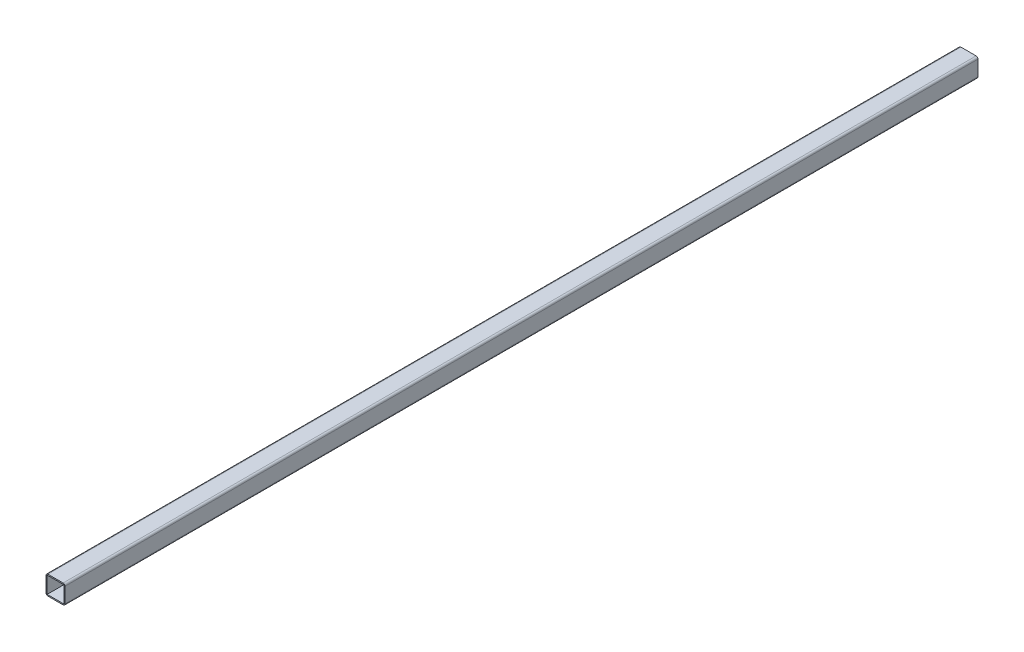
ISO-10303-21;
HEADER;
FILE_DESCRIPTION(('STEP AP214'),'2;1');
FILE_NAME('part.step','',(''),(''),'','','');
FILE_SCHEMA(('AUTOMOTIVE_DESIGN { 1 0 10303 214 1 1 1 1 }'));
ENDSEC;
DATA;
#1=APPLICATION_CONTEXT('core data for automotive mechanical design processes');
#2=APPLICATION_PROTOCOL_DEFINITION('international standard','automotive_design',2000,#1);
#3=PRODUCT_CONTEXT('',#1,'mechanical');
#4=PRODUCT('Part','Part','',(#3));
#5=PRODUCT_RELATED_PRODUCT_CATEGORY('part','',(#4));
#6=PRODUCT_DEFINITION_FORMATION('','',#4);
#7=PRODUCT_DEFINITION_CONTEXT('part definition',#1,'design');
#8=PRODUCT_DEFINITION('design','',#6,#7);
#9=PRODUCT_DEFINITION_SHAPE('','',#8);
#10=(LENGTH_UNIT() NAMED_UNIT(*) SI_UNIT(.MILLI.,.METRE.));
#11=(NAMED_UNIT(*) PLANE_ANGLE_UNIT() SI_UNIT($,.RADIAN.));
#12=(NAMED_UNIT(*) SI_UNIT($,.STERADIAN.) SOLID_ANGLE_UNIT());
#13=UNCERTAINTY_MEASURE_WITH_UNIT(LENGTH_MEASURE(1.E-05),#10,'distance_accuracy_value','');
#14=(GEOMETRIC_REPRESENTATION_CONTEXT(3) GLOBAL_UNCERTAINTY_ASSIGNED_CONTEXT((#13)) GLOBAL_UNIT_ASSIGNED_CONTEXT((#10,
#11,#12)) REPRESENTATION_CONTEXT('',''));
#15=CARTESIAN_POINT('',(0.,0.,0.));
#16=DIRECTION('',(0.,0.,1.));
#17=DIRECTION('',(1.,0.,0.));
#18=AXIS2_PLACEMENT_3D('',#15,#16,#17);
#19=CARTESIAN_POINT('',(0.,0.,2438.4));
#20=DIRECTION('',(0.,0.,1.));
#21=DIRECTION('',(1.,0.,0.));
#22=AXIS2_PLACEMENT_3D('',#19,#20,#21);
#23=PLANE('',#22);
#24=DIRECTION('',(1.,0.,0.));
#25=VECTOR('',#24,1.);
#26=CARTESIAN_POINT('',(-25.4,-25.4,2438.4));
#27=LINE('',#26,#25);
#28=CARTESIAN_POINT('',(-20.4,-25.4,2438.4));
#29=VERTEX_POINT('',#28);
#30=CARTESIAN_POINT('',(20.4,-25.4,2438.4));
#31=VERTEX_POINT('',#30);
#32=EDGE_CURVE('E173',#29,#31,#27,.T.);
#33=ORIENTED_EDGE('',*,*,#32,.T.);
#34=CARTESIAN_POINT('',(20.4,-20.4,2438.4));
#35=DIRECTION('',(0.,0.,1.));
#36=DIRECTION('',(1.,0.,0.));
#37=AXIS2_PLACEMENT_3D('',#34,#35,#36);
#38=CIRCLE('',#37,5.);
#39=CARTESIAN_POINT('',(25.4,-20.4,2438.4));
#40=VERTEX_POINT('',#39);
#41=EDGE_CURVE('E208',#31,#40,#38,.T.);
#42=ORIENTED_EDGE('',*,*,#41,.T.);
#43=DIRECTION('',(0.,1.,0.));
#44=VECTOR('',#43,1.);
#45=CARTESIAN_POINT('',(25.4,25.4,2438.4));
#46=LINE('',#45,#44);
#47=CARTESIAN_POINT('',(25.4,20.4,2438.4));
#48=VERTEX_POINT('',#47);
#49=EDGE_CURVE('E165',#40,#48,#46,.T.);
#50=ORIENTED_EDGE('',*,*,#49,.T.);
#51=CARTESIAN_POINT('',(20.4,20.4,2438.4));
#52=DIRECTION('',(0.,0.,1.));
#53=DIRECTION('',(1.,0.,0.));
#54=AXIS2_PLACEMENT_3D('',#51,#52,#53);
#55=CIRCLE('',#54,5.);
#56=CARTESIAN_POINT('',(20.4,25.4,2438.4));
#57=VERTEX_POINT('',#56);
#58=EDGE_CURVE('E203',#48,#57,#55,.T.);
#59=ORIENTED_EDGE('',*,*,#58,.T.);
#60=DIRECTION('',(-1.,0.,0.));
#61=VECTOR('',#60,1.);
#62=CARTESIAN_POINT('',(-25.4,25.4,2438.4));
#63=LINE('',#62,#61);
#64=CARTESIAN_POINT('',(-20.4,25.4,2438.4));
#65=VERTEX_POINT('',#64);
#66=EDGE_CURVE('E168',#57,#65,#63,.T.);
#67=ORIENTED_EDGE('',*,*,#66,.T.);
#68=CARTESIAN_POINT('',(-20.4,20.4,2438.4));
#69=DIRECTION('',(0.,0.,1.));
#70=DIRECTION('',(1.,0.,0.));
#71=AXIS2_PLACEMENT_3D('',#68,#69,#70);
#72=CIRCLE('',#71,5.);
#73=CARTESIAN_POINT('',(-25.4,20.4,2438.4));
#74=VERTEX_POINT('',#73);
#75=EDGE_CURVE('E55',#65,#74,#72,.T.);
#76=ORIENTED_EDGE('',*,*,#75,.T.);
#77=DIRECTION('',(0.,-1.,0.));
#78=VECTOR('',#77,1.);
#79=CARTESIAN_POINT('',(-25.4,25.4,2438.4));
#80=LINE('',#79,#78);
#81=CARTESIAN_POINT('',(-25.4,-20.4,2438.4));
#82=VERTEX_POINT('',#81);
#83=EDGE_CURVE('E171',#74,#82,#80,.T.);
#84=ORIENTED_EDGE('',*,*,#83,.T.);
#85=CARTESIAN_POINT('',(-20.4,-20.4,2438.4));
#86=DIRECTION('',(0.,0.,1.));
#87=DIRECTION('',(1.,0.,0.));
#88=AXIS2_PLACEMENT_3D('',#85,#86,#87);
#89=CIRCLE('',#88,5.);
#90=EDGE_CURVE('E206',#82,#29,#89,.T.);
#91=ORIENTED_EDGE('',*,*,#90,.T.);
#92=EDGE_LOOP('',(#33,#42,#50,#59,#67,#76,#84,#91));
#93=FACE_BOUND('',#92,.T.);
#94=DIRECTION('',(-1.,0.,0.));
#95=VECTOR('',#94,1.);
#96=CARTESIAN_POINT('',(-22.225,22.225,2438.4));
#97=LINE('',#96,#95);
#98=CARTESIAN_POINT('',(22.225,22.225,2438.4));
#99=VERTEX_POINT('',#98);
#100=CARTESIAN_POINT('',(-22.225,22.225,2438.4));
#101=VERTEX_POINT('',#100);
#102=EDGE_CURVE('E134',#99,#101,#97,.T.);
#103=ORIENTED_EDGE('',*,*,#102,.F.);
#104=DIRECTION('',(0.,1.,0.));
#105=VECTOR('',#104,1.);
#106=CARTESIAN_POINT('',(22.225,22.225,2438.4));
#107=LINE('',#106,#105);
#108=CARTESIAN_POINT('',(22.225,-22.225,2438.4));
#109=VERTEX_POINT('',#108);
#110=EDGE_CURVE('E124',#109,#99,#107,.T.);
#111=ORIENTED_EDGE('',*,*,#110,.F.);
#112=DIRECTION('',(1.,0.,0.));
#113=VECTOR('',#112,1.);
#114=CARTESIAN_POINT('',(-22.225,-22.225,2438.4));
#115=LINE('',#114,#113);
#116=CARTESIAN_POINT('',(-22.225,-22.225,2438.4));
#117=VERTEX_POINT('',#116);
#118=EDGE_CURVE('E149',#117,#109,#115,.T.);
#119=ORIENTED_EDGE('',*,*,#118,.F.);
#120=DIRECTION('',(0.,-1.,0.));
#121=VECTOR('',#120,1.);
#122=CARTESIAN_POINT('',(-22.225,22.225,2438.4));
#123=LINE('',#122,#121);
#124=EDGE_CURVE('E147',#101,#117,#123,.T.);
#125=ORIENTED_EDGE('',*,*,#124,.F.);
#126=EDGE_LOOP('',(#103,#111,#119,#125));
#127=FACE_BOUND('',#126,.T.);
#128=ADVANCED_FACE('F33',(#93,#127),#23,.T.);
#129=CARTESIAN_POINT('',(0.,0.,0.));
#130=DIRECTION('',(0.,0.,1.));
#131=DIRECTION('',(1.,0.,0.));
#132=AXIS2_PLACEMENT_3D('',#129,#130,#131);
#133=PLANE('',#132);
#134=DIRECTION('',(0.,1.,0.));
#135=VECTOR('',#134,1.);
#136=CARTESIAN_POINT('',(25.4,25.4,0.));
#137=LINE('',#136,#135);
#138=CARTESIAN_POINT('',(25.4,-20.4,0.));
#139=VERTEX_POINT('',#138);
#140=CARTESIAN_POINT('',(25.4,20.4,0.));
#141=VERTEX_POINT('',#140);
#142=EDGE_CURVE('E142',#139,#141,#137,.T.);
#143=ORIENTED_EDGE('',*,*,#142,.F.);
#144=CARTESIAN_POINT('',(20.4,-20.4,0.));
#145=DIRECTION('',(0.,0.,1.));
#146=DIRECTION('',(1.,0.,0.));
#147=AXIS2_PLACEMENT_3D('',#144,#145,#146);
#148=CIRCLE('',#147,5.);
#149=CARTESIAN_POINT('',(20.4,-25.4,0.));
#150=VERTEX_POINT('',#149);
#151=EDGE_CURVE('E196',#139,#150,#148,.F.);
#152=ORIENTED_EDGE('',*,*,#151,.T.);
#153=DIRECTION('',(1.,0.,0.));
#154=VECTOR('',#153,1.);
#155=CARTESIAN_POINT('',(-25.4,-25.4,0.));
#156=LINE('',#155,#154);
#157=CARTESIAN_POINT('',(-20.4,-25.4,0.));
#158=VERTEX_POINT('',#157);
#159=EDGE_CURVE('E169',#158,#150,#156,.T.);
#160=ORIENTED_EDGE('',*,*,#159,.F.);
#161=CARTESIAN_POINT('',(-20.4,-20.4,0.));
#162=DIRECTION('',(0.,0.,1.));
#163=DIRECTION('',(1.,0.,0.));
#164=AXIS2_PLACEMENT_3D('',#161,#162,#163);
#165=CIRCLE('',#164,5.);
#166=CARTESIAN_POINT('',(-25.4,-20.4,0.));
#167=VERTEX_POINT('',#166);
#168=EDGE_CURVE('E194',#158,#167,#165,.F.);
#169=ORIENTED_EDGE('',*,*,#168,.T.);
#170=DIRECTION('',(0.,-1.,0.));
#171=VECTOR('',#170,1.);
#172=CARTESIAN_POINT('',(-25.4,25.4,0.));
#173=LINE('',#172,#171);
#174=CARTESIAN_POINT('',(-25.4,20.4,0.));
#175=VERTEX_POINT('',#174);
#176=EDGE_CURVE('E182',#175,#167,#173,.T.);
#177=ORIENTED_EDGE('',*,*,#176,.F.);
#178=CARTESIAN_POINT('',(-20.4,20.4,0.));
#179=DIRECTION('',(0.,0.,1.));
#180=DIRECTION('',(1.,0.,0.));
#181=AXIS2_PLACEMENT_3D('',#178,#179,#180);
#182=CIRCLE('',#181,5.);
#183=CARTESIAN_POINT('',(-20.4,25.4,0.));
#184=VERTEX_POINT('',#183);
#185=EDGE_CURVE('E192',#175,#184,#182,.F.);
#186=ORIENTED_EDGE('',*,*,#185,.T.);
#187=DIRECTION('',(-1.,0.,0.));
#188=VECTOR('',#187,1.);
#189=CARTESIAN_POINT('',(-25.4,25.4,0.));
#190=LINE('',#189,#188);
#191=CARTESIAN_POINT('',(20.4,25.4,0.));
#192=VERTEX_POINT('',#191);
#193=EDGE_CURVE('E179',#192,#184,#190,.T.);
#194=ORIENTED_EDGE('',*,*,#193,.F.);
#195=CARTESIAN_POINT('',(20.4,20.4,0.));
#196=DIRECTION('',(0.,0.,1.));
#197=DIRECTION('',(1.,0.,0.));
#198=AXIS2_PLACEMENT_3D('',#195,#196,#197);
#199=CIRCLE('',#198,5.);
#200=EDGE_CURVE('E190',#192,#141,#199,.F.);
#201=ORIENTED_EDGE('',*,*,#200,.T.);
#202=EDGE_LOOP('',(#143,#152,#160,#169,#177,#186,#194,#201));
#203=FACE_BOUND('',#202,.T.);
#204=DIRECTION('',(0.,1.,0.));
#205=VECTOR('',#204,1.);
#206=CARTESIAN_POINT('',(22.225,22.225,0.));
#207=LINE('',#206,#205);
#208=CARTESIAN_POINT('',(22.225,-22.225,0.));
#209=VERTEX_POINT('',#208);
#210=CARTESIAN_POINT('',(22.225,22.225,0.));
#211=VERTEX_POINT('',#210);
#212=EDGE_CURVE('E153',#209,#211,#207,.T.);
#213=ORIENTED_EDGE('',*,*,#212,.T.);
#214=DIRECTION('',(-1.,0.,0.));
#215=VECTOR('',#214,1.);
#216=CARTESIAN_POINT('',(-22.225,22.225,0.));
#217=LINE('',#216,#215);
#218=CARTESIAN_POINT('',(-22.225,22.225,0.));
#219=VERTEX_POINT('',#218);
#220=EDGE_CURVE('E141',#211,#219,#217,.T.);
#221=ORIENTED_EDGE('',*,*,#220,.T.);
#222=DIRECTION('',(0.,-1.,0.));
#223=VECTOR('',#222,1.);
#224=CARTESIAN_POINT('',(-22.225,22.225,0.));
#225=LINE('',#224,#223);
#226=CARTESIAN_POINT('',(-22.225,-22.225,0.));
#227=VERTEX_POINT('',#226);
#228=EDGE_CURVE('E156',#219,#227,#225,.T.);
#229=ORIENTED_EDGE('',*,*,#228,.T.);
#230=DIRECTION('',(1.,0.,0.));
#231=VECTOR('',#230,1.);
#232=CARTESIAN_POINT('',(-22.225,-22.225,0.));
#233=LINE('',#232,#231);
#234=EDGE_CURVE('E135',#227,#209,#233,.T.);
#235=ORIENTED_EDGE('',*,*,#234,.T.);
#236=EDGE_LOOP('',(#213,#221,#229,#235));
#237=FACE_BOUND('',#236,.T.);
#238=ADVANCED_FACE('F224',(#203,#237),#133,.F.);
#239=CARTESIAN_POINT('',(25.4,25.4,2438.4));
#240=DIRECTION('',(-1.,0.,0.));
#241=DIRECTION('',(0.,-1.,0.));
#242=AXIS2_PLACEMENT_3D('',#239,#240,#241);
#243=PLANE('',#242);
#244=ORIENTED_EDGE('',*,*,#49,.F.);
#245=DIRECTION('',(0.,0.,-1.));
#246=VECTOR('',#245,1.);
#247=CARTESIAN_POINT('',(25.4,-20.4,2438.4));
#248=LINE('',#247,#246);
#249=EDGE_CURVE('E187',#40,#139,#248,.T.);
#250=ORIENTED_EDGE('',*,*,#249,.T.);
#251=ORIENTED_EDGE('',*,*,#142,.T.);
#252=DIRECTION('',(0.,0.,-1.));
#253=VECTOR('',#252,1.);
#254=CARTESIAN_POINT('',(25.4,20.4,2438.4));
#255=LINE('',#254,#253);
#256=EDGE_CURVE('E176',#141,#48,#255,.F.);
#257=ORIENTED_EDGE('',*,*,#256,.T.);
#258=EDGE_LOOP('',(#244,#250,#251,#257));
#259=FACE_BOUND('',#258,.T.);
#260=ADVANCED_FACE('F246',(#259),#243,.F.);
#261=CARTESIAN_POINT('',(-25.4,25.4,2438.4));
#262=DIRECTION('',(0.,-1.,0.));
#263=DIRECTION('',(1.,0.,0.));
#264=AXIS2_PLACEMENT_3D('',#261,#262,#263);
#265=PLANE('',#264);
#266=ORIENTED_EDGE('',*,*,#193,.T.);
#267=DIRECTION('',(0.,0.,-1.));
#268=VECTOR('',#267,1.);
#269=CARTESIAN_POINT('',(-20.4,25.4,2438.4));
#270=LINE('',#269,#268);
#271=EDGE_CURVE('E11',#184,#65,#270,.F.);
#272=ORIENTED_EDGE('',*,*,#271,.T.);
#273=ORIENTED_EDGE('',*,*,#66,.F.);
#274=DIRECTION('',(0.,0.,-1.));
#275=VECTOR('',#274,1.);
#276=CARTESIAN_POINT('',(20.4,25.4,2438.4));
#277=LINE('',#276,#275);
#278=EDGE_CURVE('E41',#57,#192,#277,.T.);
#279=ORIENTED_EDGE('',*,*,#278,.T.);
#280=EDGE_LOOP('',(#266,#272,#273,#279));
#281=FACE_BOUND('',#280,.T.);
#282=ADVANCED_FACE('F218',(#281),#265,.F.);
#283=CARTESIAN_POINT('',(-25.4,25.4,2438.4));
#284=DIRECTION('',(1.,0.,0.));
#285=DIRECTION('',(0.,0.,-1.));
#286=AXIS2_PLACEMENT_3D('',#283,#284,#285);
#287=PLANE('',#286);
#288=ORIENTED_EDGE('',*,*,#176,.T.);
#289=DIRECTION('',(0.,0.,-1.));
#290=VECTOR('',#289,1.);
#291=CARTESIAN_POINT('',(-25.4,-20.4,2438.4));
#292=LINE('',#291,#290);
#293=EDGE_CURVE('E48',#167,#82,#292,.F.);
#294=ORIENTED_EDGE('',*,*,#293,.T.);
#295=ORIENTED_EDGE('',*,*,#83,.F.);
#296=DIRECTION('',(0.,0.,-1.));
#297=VECTOR('',#296,1.);
#298=CARTESIAN_POINT('',(-25.4,20.4,2438.4));
#299=LINE('',#298,#297);
#300=EDGE_CURVE('E210',#74,#175,#299,.T.);
#301=ORIENTED_EDGE('',*,*,#300,.T.);
#302=EDGE_LOOP('',(#288,#294,#295,#301));
#303=FACE_BOUND('',#302,.T.);
#304=ADVANCED_FACE('F230',(#303),#287,.F.);
#305=CARTESIAN_POINT('',(-25.4,-25.4,2438.4));
#306=DIRECTION('',(0.,1.,0.));
#307=DIRECTION('',(0.,0.,1.));
#308=AXIS2_PLACEMENT_3D('',#305,#306,#307);
#309=PLANE('',#308);
#310=ORIENTED_EDGE('',*,*,#159,.T.);
#311=DIRECTION('',(0.,0.,-1.));
#312=VECTOR('',#311,1.);
#313=CARTESIAN_POINT('',(20.4,-25.4,2438.4));
#314=LINE('',#313,#312);
#315=EDGE_CURVE('E201',#150,#31,#314,.F.);
#316=ORIENTED_EDGE('',*,*,#315,.T.);
#317=ORIENTED_EDGE('',*,*,#32,.F.);
#318=DIRECTION('',(0.,0.,-1.));
#319=VECTOR('',#318,1.);
#320=CARTESIAN_POINT('',(-20.4,-25.4,2438.4));
#321=LINE('',#320,#319);
#322=EDGE_CURVE('E198',#29,#158,#321,.T.);
#323=ORIENTED_EDGE('',*,*,#322,.T.);
#324=EDGE_LOOP('',(#310,#316,#317,#323));
#325=FACE_BOUND('',#324,.T.);
#326=ADVANCED_FACE('F238',(#325),#309,.F.);
#327=CARTESIAN_POINT('',(22.225,22.225,2438.4));
#328=DIRECTION('',(-1.,0.,0.));
#329=DIRECTION('',(0.,0.,1.));
#330=AXIS2_PLACEMENT_3D('',#327,#328,#329);
#331=PLANE('',#330);
#332=ORIENTED_EDGE('',*,*,#212,.F.);
#333=DIRECTION('',(0.,0.,-1.));
#334=VECTOR('',#333,1.);
#335=CARTESIAN_POINT('',(22.225,-22.225,2438.4));
#336=LINE('',#335,#334);
#337=EDGE_CURVE('E130',#109,#209,#336,.T.);
#338=ORIENTED_EDGE('',*,*,#337,.F.);
#339=ORIENTED_EDGE('',*,*,#110,.T.);
#340=DIRECTION('',(0.,0.,-1.));
#341=VECTOR('',#340,1.);
#342=CARTESIAN_POINT('',(22.225,22.225,2438.4));
#343=LINE('',#342,#341);
#344=EDGE_CURVE('E127',#99,#211,#343,.T.);
#345=ORIENTED_EDGE('',*,*,#344,.T.);
#346=EDGE_LOOP('',(#332,#338,#339,#345));
#347=FACE_BOUND('',#346,.T.);
#348=ADVANCED_FACE('F126',(#347),#331,.T.);
#349=CARTESIAN_POINT('',(-22.225,22.225,2438.4));
#350=DIRECTION('',(0.,-1.,0.));
#351=DIRECTION('',(0.,0.,-1.));
#352=AXIS2_PLACEMENT_3D('',#349,#350,#351);
#353=PLANE('',#352);
#354=ORIENTED_EDGE('',*,*,#220,.F.);
#355=ORIENTED_EDGE('',*,*,#344,.F.);
#356=ORIENTED_EDGE('',*,*,#102,.T.);
#357=DIRECTION('',(0.,0.,-1.));
#358=VECTOR('',#357,1.);
#359=CARTESIAN_POINT('',(-22.225,22.225,2438.4));
#360=LINE('',#359,#358);
#361=EDGE_CURVE('E143',#101,#219,#360,.T.);
#362=ORIENTED_EDGE('',*,*,#361,.T.);
#363=EDGE_LOOP('',(#354,#355,#356,#362));
#364=FACE_BOUND('',#363,.T.);
#365=ADVANCED_FACE('F138',(#364),#353,.T.);
#366=CARTESIAN_POINT('',(-22.225,22.225,2438.4));
#367=DIRECTION('',(1.,0.,0.));
#368=DIRECTION('',(0.,0.,-1.));
#369=AXIS2_PLACEMENT_3D('',#366,#367,#368);
#370=PLANE('',#369);
#371=ORIENTED_EDGE('',*,*,#228,.F.);
#372=ORIENTED_EDGE('',*,*,#361,.F.);
#373=ORIENTED_EDGE('',*,*,#124,.T.);
#374=DIRECTION('',(0.,0.,-1.));
#375=VECTOR('',#374,1.);
#376=CARTESIAN_POINT('',(-22.225,-22.225,2438.4));
#377=LINE('',#376,#375);
#378=EDGE_CURVE('E162',#117,#227,#377,.T.);
#379=ORIENTED_EDGE('',*,*,#378,.T.);
#380=EDGE_LOOP('',(#371,#372,#373,#379));
#381=FACE_BOUND('',#380,.T.);
#382=ADVANCED_FACE('F302',(#381),#370,.T.);
#383=CARTESIAN_POINT('',(-22.225,-22.225,2438.4));
#384=DIRECTION('',(0.,1.,0.));
#385=DIRECTION('',(0.,0.,1.));
#386=AXIS2_PLACEMENT_3D('',#383,#384,#385);
#387=PLANE('',#386);
#388=ORIENTED_EDGE('',*,*,#234,.F.);
#389=ORIENTED_EDGE('',*,*,#378,.F.);
#390=ORIENTED_EDGE('',*,*,#118,.T.);
#391=ORIENTED_EDGE('',*,*,#337,.T.);
#392=EDGE_LOOP('',(#388,#389,#390,#391));
#393=FACE_BOUND('',#392,.T.);
#394=ADVANCED_FACE('F271',(#393),#387,.T.);
#395=CARTESIAN_POINT('',(20.4,-20.4,2438.4));
#396=DIRECTION('',(0.,0.,-1.));
#397=DIRECTION('',(-1.,0.,0.));
#398=AXIS2_PLACEMENT_3D('',#395,#396,#397);
#399=CYLINDRICAL_SURFACE('',#398,5.);
#400=ORIENTED_EDGE('',*,*,#41,.F.);
#401=ORIENTED_EDGE('',*,*,#315,.F.);
#402=ORIENTED_EDGE('',*,*,#151,.F.);
#403=ORIENTED_EDGE('',*,*,#249,.F.);
#404=EDGE_LOOP('',(#400,#401,#402,#403));
#405=FACE_BOUND('',#404,.T.);
#406=ADVANCED_FACE('F243',(#405),#399,.T.);
#407=CARTESIAN_POINT('',(-20.4,-20.4,2438.4));
#408=DIRECTION('',(0.,0.,-1.));
#409=DIRECTION('',(-1.,0.,0.));
#410=AXIS2_PLACEMENT_3D('',#407,#408,#409);
#411=CYLINDRICAL_SURFACE('',#410,5.);
#412=ORIENTED_EDGE('',*,*,#90,.F.);
#413=ORIENTED_EDGE('',*,*,#293,.F.);
#414=ORIENTED_EDGE('',*,*,#168,.F.);
#415=ORIENTED_EDGE('',*,*,#322,.F.);
#416=EDGE_LOOP('',(#412,#413,#414,#415));
#417=FACE_BOUND('',#416,.T.);
#418=ADVANCED_FACE('F235',(#417),#411,.T.);
#419=CARTESIAN_POINT('',(-20.4,20.4,2438.4));
#420=DIRECTION('',(0.,0.,-1.));
#421=DIRECTION('',(-1.,0.,0.));
#422=AXIS2_PLACEMENT_3D('',#419,#420,#421);
#423=CYLINDRICAL_SURFACE('',#422,5.);
#424=ORIENTED_EDGE('',*,*,#75,.F.);
#425=ORIENTED_EDGE('',*,*,#271,.F.);
#426=ORIENTED_EDGE('',*,*,#185,.F.);
#427=ORIENTED_EDGE('',*,*,#300,.F.);
#428=EDGE_LOOP('',(#424,#425,#426,#427));
#429=FACE_BOUND('',#428,.T.);
#430=ADVANCED_FACE('F229',(#429),#423,.T.);
#431=CARTESIAN_POINT('',(20.4,20.4,2438.4));
#432=DIRECTION('',(0.,0.,-1.));
#433=DIRECTION('',(-1.,0.,0.));
#434=AXIS2_PLACEMENT_3D('',#431,#432,#433);
#435=CYLINDRICAL_SURFACE('',#434,5.);
#436=ORIENTED_EDGE('',*,*,#58,.F.);
#437=ORIENTED_EDGE('',*,*,#256,.F.);
#438=ORIENTED_EDGE('',*,*,#200,.F.);
#439=ORIENTED_EDGE('',*,*,#278,.F.);
#440=EDGE_LOOP('',(#436,#437,#438,#439));
#441=FACE_BOUND('',#440,.T.);
#442=ADVANCED_FACE('F35',(#441),#435,.T.);
#443=CLOSED_SHELL('',(#128,#238,#260,#282,#304,#326,#348,#365,#382,#394,#406,#418,#430,#442));
#444=MANIFOLD_SOLID_BREP('B2',#443);
#445=ADVANCED_BREP_SHAPE_REPRESENTATION('',(#18,#444),#14);
#446=SHAPE_DEFINITION_REPRESENTATION(#9,#445);
ENDSEC;
END-ISO-10303-21;
